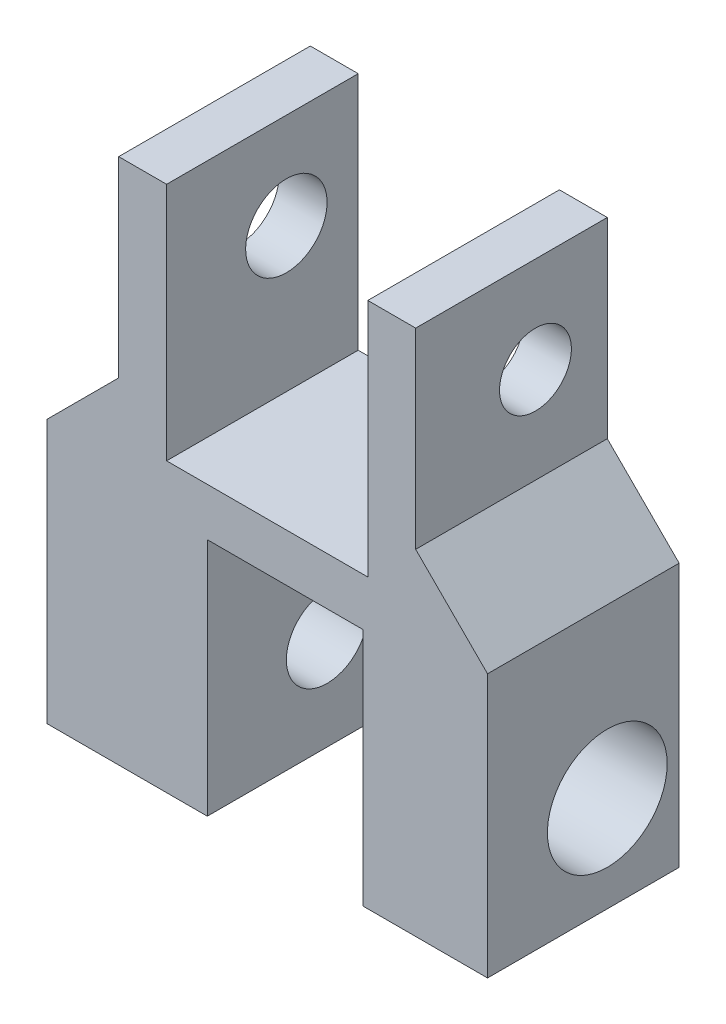
ISO-10303-21;
HEADER;
FILE_DESCRIPTION(('STEP AP214'),'2;1');
FILE_NAME('part.step','',(''),(''),'','','');
FILE_SCHEMA(('AUTOMOTIVE_DESIGN { 1 0 10303 214 1 1 1 1 }'));
ENDSEC;
DATA;
#1=APPLICATION_CONTEXT('core data for automotive mechanical design processes');
#2=APPLICATION_PROTOCOL_DEFINITION('international standard','automotive_design',2000,#1);
#3=PRODUCT_CONTEXT('',#1,'mechanical');
#4=PRODUCT('Part','Part','',(#3));
#5=PRODUCT_RELATED_PRODUCT_CATEGORY('part','',(#4));
#6=PRODUCT_DEFINITION_FORMATION('','',#4);
#7=PRODUCT_DEFINITION_CONTEXT('part definition',#1,'design');
#8=PRODUCT_DEFINITION('design','',#6,#7);
#9=PRODUCT_DEFINITION_SHAPE('','',#8);
#10=(LENGTH_UNIT() NAMED_UNIT(*) SI_UNIT(.MILLI.,.METRE.));
#11=(NAMED_UNIT(*) PLANE_ANGLE_UNIT() SI_UNIT($,.RADIAN.));
#12=(NAMED_UNIT(*) SI_UNIT($,.STERADIAN.) SOLID_ANGLE_UNIT());
#13=UNCERTAINTY_MEASURE_WITH_UNIT(LENGTH_MEASURE(1.E-05),#10,'distance_accuracy_value','');
#14=(GEOMETRIC_REPRESENTATION_CONTEXT(3) GLOBAL_UNCERTAINTY_ASSIGNED_CONTEXT((#13)) GLOBAL_UNIT_ASSIGNED_CONTEXT((#10,
#11,#12)) REPRESENTATION_CONTEXT('',''));
#15=CARTESIAN_POINT('',(0.,0.,0.));
#16=DIRECTION('',(0.,0.,1.));
#17=DIRECTION('',(1.,0.,0.));
#18=AXIS2_PLACEMENT_3D('',#15,#16,#17);
#19=CARTESIAN_POINT('',(4.2,0.,8.));
#20=DIRECTION('',(1.,0.,0.));
#21=DIRECTION('',(0.,0.,-1.));
#22=AXIS2_PLACEMENT_3D('',#19,#20,#21);
#23=PLANE('',#22);
#24=CARTESIAN_POINT('',(4.2,6.,3.));
#25=DIRECTION('',(-1.,0.,0.));
#26=DIRECTION('',(0.,-1.,0.));
#27=AXIS2_PLACEMENT_3D('',#24,#25,#26);
#28=CIRCLE('',#27,1.5);
#29=CARTESIAN_POINT('',(4.2,4.5,3.));
#30=VERTEX_POINT('',#29);
#31=EDGE_CURVE('E318',#30,#30,#28,.T.);
#32=ORIENTED_EDGE('',*,*,#31,.F.);
#33=EDGE_LOOP('',(#32));
#34=FACE_BOUND('',#33,.T.);
#35=DIRECTION('',(0.,-1.,0.));
#36=VECTOR('',#35,1.);
#37=CARTESIAN_POINT('',(4.2,0.,0.));
#38=LINE('',#37,#36);
#39=CARTESIAN_POINT('',(4.2,10.,0.));
#40=VERTEX_POINT('',#39);
#41=CARTESIAN_POINT('',(4.2,0.,0.));
#42=VERTEX_POINT('',#41);
#43=EDGE_CURVE('E179',#40,#42,#38,.T.);
#44=ORIENTED_EDGE('',*,*,#43,.T.);
#45=DIRECTION('',(0.,0.,-1.));
#46=VECTOR('',#45,1.);
#47=CARTESIAN_POINT('',(4.2,0.,8.));
#48=LINE('',#47,#46);
#49=CARTESIAN_POINT('',(4.2,0.,8.));
#50=VERTEX_POINT('',#49);
#51=EDGE_CURVE('E11',#50,#42,#48,.T.);
#52=ORIENTED_EDGE('',*,*,#51,.F.);
#53=DIRECTION('',(0.,-1.,0.));
#54=VECTOR('',#53,1.);
#55=CARTESIAN_POINT('',(4.2,0.,8.));
#56=LINE('',#55,#54);
#57=CARTESIAN_POINT('',(4.2,10.,8.));
#58=VERTEX_POINT('',#57);
#59=EDGE_CURVE('E211',#58,#50,#56,.T.);
#60=ORIENTED_EDGE('',*,*,#59,.F.);
#61=DIRECTION('',(0.,0.,-1.));
#62=VECTOR('',#61,1.);
#63=CARTESIAN_POINT('',(4.2,10.,8.));
#64=LINE('',#63,#62);
#65=EDGE_CURVE('E175',#58,#40,#64,.T.);
#66=ORIENTED_EDGE('',*,*,#65,.T.);
#67=EDGE_LOOP('',(#44,#52,#60,#66));
#68=FACE_BOUND('',#67,.T.);
#69=ADVANCED_FACE('F34',(#34,#68),#23,.F.);
#70=CARTESIAN_POINT('',(-4.2,0.,8.));
#71=DIRECTION('',(0.,-1.,0.));
#72=DIRECTION('',(1.,0.,0.));
#73=AXIS2_PLACEMENT_3D('',#70,#71,#72);
#74=PLANE('',#73);
#75=DIRECTION('',(-1.,0.,0.));
#76=VECTOR('',#75,1.);
#77=CARTESIAN_POINT('',(-4.2,0.,0.));
#78=LINE('',#77,#76);
#79=CARTESIAN_POINT('',(-4.2,0.,0.));
#80=VERTEX_POINT('',#79);
#81=EDGE_CURVE('E182',#42,#80,#78,.T.);
#82=ORIENTED_EDGE('',*,*,#81,.T.);
#83=DIRECTION('',(0.,0.,-1.));
#84=VECTOR('',#83,1.);
#85=CARTESIAN_POINT('',(-4.2,0.,8.));
#86=LINE('',#85,#84);
#87=CARTESIAN_POINT('',(-4.2,0.,8.));
#88=VERTEX_POINT('',#87);
#89=EDGE_CURVE('E43',#88,#80,#86,.T.);
#90=ORIENTED_EDGE('',*,*,#89,.F.);
#91=DIRECTION('',(-1.,0.,0.));
#92=VECTOR('',#91,1.);
#93=CARTESIAN_POINT('',(-4.2,0.,8.));
#94=LINE('',#93,#92);
#95=EDGE_CURVE('E118',#50,#88,#94,.T.);
#96=ORIENTED_EDGE('',*,*,#95,.F.);
#97=ORIENTED_EDGE('',*,*,#51,.T.);
#98=EDGE_LOOP('',(#82,#90,#96,#97));
#99=FACE_BOUND('',#98,.T.);
#100=ADVANCED_FACE('F311',(#99),#74,.F.);
#101=CARTESIAN_POINT('',(-4.2,0.,8.));
#102=DIRECTION('',(-1.,0.,0.));
#103=DIRECTION('',(0.,-1.,0.));
#104=AXIS2_PLACEMENT_3D('',#101,#102,#103);
#105=PLANE('',#104);
#106=CARTESIAN_POINT('',(-4.2,6.,3.));
#107=DIRECTION('',(-1.,0.,0.));
#108=DIRECTION('',(0.,-1.,0.));
#109=AXIS2_PLACEMENT_3D('',#106,#107,#108);
#110=CIRCLE('',#109,1.7);
#111=CARTESIAN_POINT('',(-4.2,4.3,3.));
#112=VERTEX_POINT('',#111);
#113=EDGE_CURVE('E324',#112,#112,#110,.F.);
#114=ORIENTED_EDGE('',*,*,#113,.F.);
#115=EDGE_LOOP('',(#114));
#116=FACE_BOUND('',#115,.T.);
#117=DIRECTION('',(0.,1.,0.));
#118=VECTOR('',#117,1.);
#119=CARTESIAN_POINT('',(-4.2,0.,0.));
#120=LINE('',#119,#118);
#121=CARTESIAN_POINT('',(-4.2,10.,0.));
#122=VERTEX_POINT('',#121);
#123=EDGE_CURVE('E185',#80,#122,#120,.T.);
#124=ORIENTED_EDGE('',*,*,#123,.T.);
#125=DIRECTION('',(0.,0.,-1.));
#126=VECTOR('',#125,1.);
#127=CARTESIAN_POINT('',(-4.2,10.,8.));
#128=LINE('',#127,#126);
#129=CARTESIAN_POINT('',(-4.2,10.,8.));
#130=VERTEX_POINT('',#129);
#131=EDGE_CURVE('E242',#130,#122,#128,.T.);
#132=ORIENTED_EDGE('',*,*,#131,.F.);
#133=DIRECTION('',(0.,1.,0.));
#134=VECTOR('',#133,1.);
#135=CARTESIAN_POINT('',(-4.2,0.,8.));
#136=LINE('',#135,#134);
#137=EDGE_CURVE('E251',#88,#130,#136,.T.);
#138=ORIENTED_EDGE('',*,*,#137,.F.);
#139=ORIENTED_EDGE('',*,*,#89,.T.);
#140=EDGE_LOOP('',(#124,#132,#138,#139));
#141=FACE_BOUND('',#140,.T.);
#142=ADVANCED_FACE('F249',(#116,#141),#105,.F.);
#143=CARTESIAN_POINT('',(-4.2,10.,8.));
#144=DIRECTION('',(0.,-1.,0.));
#145=DIRECTION('',(0.,0.,-1.));
#146=AXIS2_PLACEMENT_3D('',#143,#144,#145);
#147=PLANE('',#146);
#148=DIRECTION('',(-1.,0.,0.));
#149=VECTOR('',#148,1.);
#150=CARTESIAN_POINT('',(-4.2,10.,0.));
#151=LINE('',#150,#149);
#152=CARTESIAN_POINT('',(-6.2,10.,0.));
#153=VERTEX_POINT('',#152);
#154=EDGE_CURVE('E187',#122,#153,#151,.T.);
#155=ORIENTED_EDGE('',*,*,#154,.T.);
#156=DIRECTION('',(0.,0.,-1.));
#157=VECTOR('',#156,1.);
#158=CARTESIAN_POINT('',(-6.2,10.,8.));
#159=LINE('',#158,#157);
#160=CARTESIAN_POINT('',(-6.2,10.,8.));
#161=VERTEX_POINT('',#160);
#162=EDGE_CURVE('E239',#161,#153,#159,.T.);
#163=ORIENTED_EDGE('',*,*,#162,.F.);
#164=DIRECTION('',(-1.,0.,0.));
#165=VECTOR('',#164,1.);
#166=CARTESIAN_POINT('',(-4.2,10.,8.));
#167=LINE('',#166,#165);
#168=EDGE_CURVE('E269',#130,#161,#167,.T.);
#169=ORIENTED_EDGE('',*,*,#168,.F.);
#170=ORIENTED_EDGE('',*,*,#131,.T.);
#171=EDGE_LOOP('',(#155,#163,#169,#170));
#172=FACE_BOUND('',#171,.T.);
#173=ADVANCED_FACE('F260',(#172),#147,.F.);
#174=CARTESIAN_POINT('',(-6.2,10.,8.));
#175=DIRECTION('',(1.,0.,0.));
#176=DIRECTION('',(0.,1.,0.));
#177=AXIS2_PLACEMENT_3D('',#174,#175,#176);
#178=PLANE('',#177);
#179=CARTESIAN_POINT('',(-6.2,6.,3.));
#180=DIRECTION('',(-1.,0.,0.));
#181=DIRECTION('',(0.,-1.,0.));
#182=AXIS2_PLACEMENT_3D('',#179,#180,#181);
#183=CIRCLE('',#182,1.7);
#184=CARTESIAN_POINT('',(-6.2,4.3,3.));
#185=VERTEX_POINT('',#184);
#186=EDGE_CURVE('E322',#185,#185,#183,.T.);
#187=ORIENTED_EDGE('',*,*,#186,.F.);
#188=EDGE_LOOP('',(#187));
#189=FACE_BOUND('',#188,.T.);
#190=DIRECTION('',(0.,-1.,0.));
#191=VECTOR('',#190,1.);
#192=CARTESIAN_POINT('',(-6.2,10.,0.));
#193=LINE('',#192,#191);
#194=CARTESIAN_POINT('',(-6.2,2.00000000000003,0.));
#195=VERTEX_POINT('',#194);
#196=EDGE_CURVE('E189',#153,#195,#193,.T.);
#197=ORIENTED_EDGE('',*,*,#196,.T.);
#198=DIRECTION('',(0.,0.,-1.));
#199=VECTOR('',#198,1.);
#200=CARTESIAN_POINT('',(-6.2,2.00000000000003,8.));
#201=LINE('',#200,#199);
#202=CARTESIAN_POINT('',(-6.2,2.00000000000003,8.));
#203=VERTEX_POINT('',#202);
#204=EDGE_CURVE('E236',#203,#195,#201,.T.);
#205=ORIENTED_EDGE('',*,*,#204,.F.);
#206=DIRECTION('',(0.,-1.,0.));
#207=VECTOR('',#206,1.);
#208=CARTESIAN_POINT('',(-6.2,10.,8.));
#209=LINE('',#208,#207);
#210=EDGE_CURVE('E266',#161,#203,#209,.T.);
#211=ORIENTED_EDGE('',*,*,#210,.F.);
#212=ORIENTED_EDGE('',*,*,#162,.T.);
#213=EDGE_LOOP('',(#197,#205,#211,#212));
#214=FACE_BOUND('',#213,.T.);
#215=ADVANCED_FACE('F264',(#189,#214),#178,.F.);
#216=CARTESIAN_POINT('',(-9.2,-0.999999999999999,8.));
#217=DIRECTION('',(0.707106781186552,-0.707106781186543,0.));
#218=DIRECTION('',(0.707106781186543,0.707106781186552,0.));
#219=AXIS2_PLACEMENT_3D('',#216,#217,#218);
#220=PLANE('',#219);
#221=DIRECTION('',(-0.707106781186543,-0.707106781186551,0.));
#222=VECTOR('',#221,1.);
#223=CARTESIAN_POINT('',(-9.2,-0.999999999999999,0.));
#224=LINE('',#223,#222);
#225=CARTESIAN_POINT('',(-9.2,-0.999999999999999,0.));
#226=VERTEX_POINT('',#225);
#227=EDGE_CURVE('E191',#195,#226,#224,.T.);
#228=ORIENTED_EDGE('',*,*,#227,.T.);
#229=DIRECTION('',(0.,0.,-1.));
#230=VECTOR('',#229,1.);
#231=CARTESIAN_POINT('',(-9.2,-0.999999999999999,8.));
#232=LINE('',#231,#230);
#233=CARTESIAN_POINT('',(-9.2,-0.999999999999999,8.));
#234=VERTEX_POINT('',#233);
#235=EDGE_CURVE('E233',#234,#226,#232,.T.);
#236=ORIENTED_EDGE('',*,*,#235,.F.);
#237=DIRECTION('',(-0.707106781186543,-0.707106781186551,0.));
#238=VECTOR('',#237,1.);
#239=CARTESIAN_POINT('',(-9.2,-0.999999999999999,8.));
#240=LINE('',#239,#238);
#241=EDGE_CURVE('E268',#203,#234,#240,.T.);
#242=ORIENTED_EDGE('',*,*,#241,.F.);
#243=ORIENTED_EDGE('',*,*,#204,.T.);
#244=EDGE_LOOP('',(#228,#236,#242,#243));
#245=FACE_BOUND('',#244,.T.);
#246=ADVANCED_FACE('F371',(#245),#220,.F.);
#247=CARTESIAN_POINT('',(-9.2,-0.999999999999999,8.));
#248=DIRECTION('',(1.,0.,0.));
#249=DIRECTION('',(0.,1.,0.));
#250=AXIS2_PLACEMENT_3D('',#247,#248,#249);
#251=PLANE('',#250);
#252=CARTESIAN_POINT('',(-9.2,-7.99999999999999,3.));
#253=DIRECTION('',(-1.,0.,0.));
#254=DIRECTION('',(0.,0.,1.));
#255=AXIS2_PLACEMENT_3D('',#252,#253,#254);
#256=CIRCLE('',#255,1.7);
#257=CARTESIAN_POINT('',(-9.2,-7.99999999999999,4.7));
#258=VERTEX_POINT('',#257);
#259=EDGE_CURVE('E327',#258,#258,#256,.T.);
#260=ORIENTED_EDGE('',*,*,#259,.F.);
#261=EDGE_LOOP('',(#260));
#262=FACE_BOUND('',#261,.T.);
#263=DIRECTION('',(0.,-1.,0.));
#264=VECTOR('',#263,1.);
#265=CARTESIAN_POINT('',(-9.2,-0.999999999999999,0.));
#266=LINE('',#265,#264);
#267=CARTESIAN_POINT('',(-9.2,-12.,0.));
#268=VERTEX_POINT('',#267);
#269=EDGE_CURVE('E193',#226,#268,#266,.T.);
#270=ORIENTED_EDGE('',*,*,#269,.T.);
#271=DIRECTION('',(0.,0.,-1.));
#272=VECTOR('',#271,1.);
#273=CARTESIAN_POINT('',(-9.2,-12.,8.));
#274=LINE('',#273,#272);
#275=CARTESIAN_POINT('',(-9.2,-12.,8.));
#276=VERTEX_POINT('',#275);
#277=EDGE_CURVE('E230',#276,#268,#274,.T.);
#278=ORIENTED_EDGE('',*,*,#277,.F.);
#279=DIRECTION('',(0.,-1.,0.));
#280=VECTOR('',#279,1.);
#281=CARTESIAN_POINT('',(-9.2,-0.999999999999999,8.));
#282=LINE('',#281,#280);
#283=EDGE_CURVE('E271',#234,#276,#282,.T.);
#284=ORIENTED_EDGE('',*,*,#283,.F.);
#285=ORIENTED_EDGE('',*,*,#235,.T.);
#286=EDGE_LOOP('',(#270,#278,#284,#285));
#287=FACE_BOUND('',#286,.T.);
#288=ADVANCED_FACE('F368',(#262,#287),#251,.F.);
#289=CARTESIAN_POINT('',(-9.2,-12.,8.));
#290=DIRECTION('',(0.,1.,0.));
#291=DIRECTION('',(-1.,0.,0.));
#292=AXIS2_PLACEMENT_3D('',#289,#290,#291);
#293=PLANE('',#292);
#294=DIRECTION('',(1.,0.,0.));
#295=VECTOR('',#294,1.);
#296=CARTESIAN_POINT('',(-9.2,-12.,0.));
#297=LINE('',#296,#295);
#298=CARTESIAN_POINT('',(-2.5,-12.,0.));
#299=VERTEX_POINT('',#298);
#300=EDGE_CURVE('E195',#268,#299,#297,.T.);
#301=ORIENTED_EDGE('',*,*,#300,.T.);
#302=DIRECTION('',(0.,0.,-1.));
#303=VECTOR('',#302,1.);
#304=CARTESIAN_POINT('',(-2.5,-12.,8.));
#305=LINE('',#304,#303);
#306=CARTESIAN_POINT('',(-2.5,-12.,8.));
#307=VERTEX_POINT('',#306);
#308=EDGE_CURVE('E227',#307,#299,#305,.T.);
#309=ORIENTED_EDGE('',*,*,#308,.F.);
#310=DIRECTION('',(1.,0.,0.));
#311=VECTOR('',#310,1.);
#312=CARTESIAN_POINT('',(-9.2,-12.,8.));
#313=LINE('',#312,#311);
#314=EDGE_CURVE('E277',#276,#307,#313,.T.);
#315=ORIENTED_EDGE('',*,*,#314,.F.);
#316=ORIENTED_EDGE('',*,*,#277,.T.);
#317=EDGE_LOOP('',(#301,#309,#315,#316));
#318=FACE_BOUND('',#317,.T.);
#319=ADVANCED_FACE('F365',(#318),#293,.F.);
#320=CARTESIAN_POINT('',(-2.5,-12.,8.));
#321=DIRECTION('',(-1.,0.,0.));
#322=DIRECTION('',(0.,0.,1.));
#323=AXIS2_PLACEMENT_3D('',#320,#321,#322);
#324=PLANE('',#323);
#325=CARTESIAN_POINT('',(-2.5,-7.99999999999999,3.));
#326=DIRECTION('',(-1.,0.,0.));
#327=DIRECTION('',(0.,0.,1.));
#328=AXIS2_PLACEMENT_3D('',#325,#326,#327);
#329=CIRCLE('',#328,1.7);
#330=CARTESIAN_POINT('',(-2.5,-7.99999999999999,4.7));
#331=VERTEX_POINT('',#330);
#332=EDGE_CURVE('E332',#331,#331,#329,.F.);
#333=ORIENTED_EDGE('',*,*,#332,.F.);
#334=EDGE_LOOP('',(#333));
#335=FACE_BOUND('',#334,.T.);
#336=DIRECTION('',(0.,1.,0.));
#337=VECTOR('',#336,1.);
#338=CARTESIAN_POINT('',(-2.5,-12.,0.));
#339=LINE('',#338,#337);
#340=CARTESIAN_POINT('',(-2.5,-2.,0.));
#341=VERTEX_POINT('',#340);
#342=EDGE_CURVE('E197',#299,#341,#339,.T.);
#343=ORIENTED_EDGE('',*,*,#342,.T.);
#344=DIRECTION('',(0.,0.,-1.));
#345=VECTOR('',#344,1.);
#346=CARTESIAN_POINT('',(-2.5,-2.,8.));
#347=LINE('',#346,#345);
#348=CARTESIAN_POINT('',(-2.5,-2.,8.));
#349=VERTEX_POINT('',#348);
#350=EDGE_CURVE('E224',#349,#341,#347,.T.);
#351=ORIENTED_EDGE('',*,*,#350,.F.);
#352=DIRECTION('',(0.,1.,0.));
#353=VECTOR('',#352,1.);
#354=CARTESIAN_POINT('',(-2.5,-12.,8.));
#355=LINE('',#354,#353);
#356=EDGE_CURVE('E279',#307,#349,#355,.T.);
#357=ORIENTED_EDGE('',*,*,#356,.F.);
#358=ORIENTED_EDGE('',*,*,#308,.T.);
#359=EDGE_LOOP('',(#343,#351,#357,#358));
#360=FACE_BOUND('',#359,.T.);
#361=ADVANCED_FACE('F357',(#335,#360),#324,.F.);
#362=CARTESIAN_POINT('',(4.,-2.,8.));
#363=DIRECTION('',(0.,1.,0.));
#364=DIRECTION('',(-1.,0.,0.));
#365=AXIS2_PLACEMENT_3D('',#362,#363,#364);
#366=PLANE('',#365);
#367=DIRECTION('',(1.,0.,0.));
#368=VECTOR('',#367,1.);
#369=CARTESIAN_POINT('',(4.,-2.,0.));
#370=LINE('',#369,#368);
#371=CARTESIAN_POINT('',(4.,-2.,0.));
#372=VERTEX_POINT('',#371);
#373=EDGE_CURVE('E200',#341,#372,#370,.T.);
#374=ORIENTED_EDGE('',*,*,#373,.T.);
#375=DIRECTION('',(0.,0.,-1.));
#376=VECTOR('',#375,1.);
#377=CARTESIAN_POINT('',(4.,-2.,8.));
#378=LINE('',#377,#376);
#379=CARTESIAN_POINT('',(4.,-2.,8.));
#380=VERTEX_POINT('',#379);
#381=EDGE_CURVE('E221',#380,#372,#378,.T.);
#382=ORIENTED_EDGE('',*,*,#381,.F.);
#383=DIRECTION('',(1.,0.,0.));
#384=VECTOR('',#383,1.);
#385=CARTESIAN_POINT('',(-2.5,-2.,8.));
#386=LINE('',#385,#384);
#387=EDGE_CURVE('E281',#349,#380,#386,.T.);
#388=ORIENTED_EDGE('',*,*,#387,.F.);
#389=ORIENTED_EDGE('',*,*,#350,.T.);
#390=EDGE_LOOP('',(#374,#382,#388,#389));
#391=FACE_BOUND('',#390,.T.);
#392=ADVANCED_FACE('F348',(#391),#366,.F.);
#393=CARTESIAN_POINT('',(4.,-12.,8.));
#394=DIRECTION('',(1.,0.,0.));
#395=DIRECTION('',(0.,0.,-1.));
#396=AXIS2_PLACEMENT_3D('',#393,#394,#395);
#397=PLANE('',#396);
#398=CARTESIAN_POINT('',(4.,-7.99999999999999,3.));
#399=DIRECTION('',(1.,0.,0.));
#400=DIRECTION('',(0.,0.,-1.));
#401=AXIS2_PLACEMENT_3D('',#398,#399,#400);
#402=CIRCLE('',#401,2.5);
#403=CARTESIAN_POINT('',(4.,-7.99999999999999,0.499999999999999));
#404=VERTEX_POINT('',#403);
#405=EDGE_CURVE('E183',#404,#404,#402,.F.);
#406=ORIENTED_EDGE('',*,*,#405,.F.);
#407=EDGE_LOOP('',(#406));
#408=FACE_BOUND('',#407,.T.);
#409=DIRECTION('',(0.,-1.,0.));
#410=VECTOR('',#409,1.);
#411=CARTESIAN_POINT('',(4.,-12.,0.));
#412=LINE('',#411,#410);
#413=CARTESIAN_POINT('',(4.,-12.,0.));
#414=VERTEX_POINT('',#413);
#415=EDGE_CURVE('E202',#372,#414,#412,.T.);
#416=ORIENTED_EDGE('',*,*,#415,.T.);
#417=DIRECTION('',(0.,0.,-1.));
#418=VECTOR('',#417,1.);
#419=CARTESIAN_POINT('',(4.,-12.,8.));
#420=LINE('',#419,#418);
#421=CARTESIAN_POINT('',(4.,-12.,8.));
#422=VERTEX_POINT('',#421);
#423=EDGE_CURVE('E218',#422,#414,#420,.T.);
#424=ORIENTED_EDGE('',*,*,#423,.F.);
#425=DIRECTION('',(0.,-1.,0.));
#426=VECTOR('',#425,1.);
#427=CARTESIAN_POINT('',(4.,-12.,8.));
#428=LINE('',#427,#426);
#429=EDGE_CURVE('E283',#380,#422,#428,.T.);
#430=ORIENTED_EDGE('',*,*,#429,.F.);
#431=ORIENTED_EDGE('',*,*,#381,.T.);
#432=EDGE_LOOP('',(#416,#424,#430,#431));
#433=FACE_BOUND('',#432,.T.);
#434=ADVANCED_FACE('F345',(#408,#433),#397,.F.);
#435=CARTESIAN_POINT('',(4.,-12.,8.));
#436=DIRECTION('',(0.,1.,0.));
#437=DIRECTION('',(-1.,0.,0.));
#438=AXIS2_PLACEMENT_3D('',#435,#436,#437);
#439=PLANE('',#438);
#440=DIRECTION('',(1.,0.,0.));
#441=VECTOR('',#440,1.);
#442=CARTESIAN_POINT('',(4.,-12.,0.));
#443=LINE('',#442,#441);
#444=CARTESIAN_POINT('',(9.2,-12.,0.));
#445=VERTEX_POINT('',#444);
#446=EDGE_CURVE('E204',#414,#445,#443,.T.);
#447=ORIENTED_EDGE('',*,*,#446,.T.);
#448=DIRECTION('',(0.,0.,-1.));
#449=VECTOR('',#448,1.);
#450=CARTESIAN_POINT('',(9.2,-12.,8.));
#451=LINE('',#450,#449);
#452=CARTESIAN_POINT('',(9.2,-12.,8.));
#453=VERTEX_POINT('',#452);
#454=EDGE_CURVE('E215',#453,#445,#451,.T.);
#455=ORIENTED_EDGE('',*,*,#454,.F.);
#456=DIRECTION('',(1.,0.,0.));
#457=VECTOR('',#456,1.);
#458=CARTESIAN_POINT('',(4.,-12.,8.));
#459=LINE('',#458,#457);
#460=EDGE_CURVE('E285',#422,#453,#459,.T.);
#461=ORIENTED_EDGE('',*,*,#460,.F.);
#462=ORIENTED_EDGE('',*,*,#423,.T.);
#463=EDGE_LOOP('',(#447,#455,#461,#462));
#464=FACE_BOUND('',#463,.T.);
#465=ADVANCED_FACE('F291',(#464),#439,.F.);
#466=CARTESIAN_POINT('',(9.2,-0.999999999999997,8.));
#467=DIRECTION('',(-1.,0.,0.));
#468=DIRECTION('',(0.,-1.,0.));
#469=AXIS2_PLACEMENT_3D('',#466,#467,#468);
#470=PLANE('',#469);
#471=CARTESIAN_POINT('',(9.2,-7.99999999999999,3.));
#472=DIRECTION('',(-1.,0.,0.));
#473=DIRECTION('',(0.,-1.,0.));
#474=AXIS2_PLACEMENT_3D('',#471,#472,#473);
#475=CIRCLE('',#474,2.5);
#476=CARTESIAN_POINT('',(9.2,-10.5,3.));
#477=VERTEX_POINT('',#476);
#478=EDGE_CURVE('E335',#477,#477,#475,.T.);
#479=ORIENTED_EDGE('',*,*,#478,.T.);
#480=EDGE_LOOP('',(#479));
#481=FACE_BOUND('',#480,.T.);
#482=DIRECTION('',(0.,1.,0.));
#483=VECTOR('',#482,1.);
#484=CARTESIAN_POINT('',(9.2,-0.999999999999997,0.));
#485=LINE('',#484,#483);
#486=CARTESIAN_POINT('',(9.2,-0.999999999999997,0.));
#487=VERTEX_POINT('',#486);
#488=EDGE_CURVE('E206',#445,#487,#485,.T.);
#489=ORIENTED_EDGE('',*,*,#488,.T.);
#490=DIRECTION('',(0.,0.,-1.));
#491=VECTOR('',#490,1.);
#492=CARTESIAN_POINT('',(9.2,-0.999999999999997,8.));
#493=LINE('',#492,#491);
#494=CARTESIAN_POINT('',(9.2,-0.999999999999997,8.));
#495=VERTEX_POINT('',#494);
#496=EDGE_CURVE('E170',#495,#487,#493,.T.);
#497=ORIENTED_EDGE('',*,*,#496,.F.);
#498=DIRECTION('',(0.,1.,0.));
#499=VECTOR('',#498,1.);
#500=CARTESIAN_POINT('',(9.2,-0.999999999999997,8.));
#501=LINE('',#500,#499);
#502=EDGE_CURVE('E161',#453,#495,#501,.T.);
#503=ORIENTED_EDGE('',*,*,#502,.F.);
#504=ORIENTED_EDGE('',*,*,#454,.T.);
#505=EDGE_LOOP('',(#489,#497,#503,#504));
#506=FACE_BOUND('',#505,.T.);
#507=ADVANCED_FACE('F295',(#481,#506),#470,.F.);
#508=CARTESIAN_POINT('',(9.2,-0.999999999999997,8.));
#509=DIRECTION('',(-0.707106781186552,-0.707106781186543,0.));
#510=DIRECTION('',(0.707106781186543,-0.707106781186552,0.));
#511=AXIS2_PLACEMENT_3D('',#508,#509,#510);
#512=PLANE('',#511);
#513=DIRECTION('',(-0.707106781186543,0.707106781186552,0.));
#514=VECTOR('',#513,1.);
#515=CARTESIAN_POINT('',(9.2,-0.999999999999997,0.));
#516=LINE('',#515,#514);
#517=CARTESIAN_POINT('',(6.2,2.00000000000004,0.));
#518=VERTEX_POINT('',#517);
#519=EDGE_CURVE('E169',#487,#518,#516,.T.);
#520=ORIENTED_EDGE('',*,*,#519,.T.);
#521=DIRECTION('',(0.,0.,-1.));
#522=VECTOR('',#521,1.);
#523=CARTESIAN_POINT('',(6.2,2.00000000000004,8.));
#524=LINE('',#523,#522);
#525=CARTESIAN_POINT('',(6.2,2.00000000000004,8.));
#526=VERTEX_POINT('',#525);
#527=EDGE_CURVE('E166',#526,#518,#524,.T.);
#528=ORIENTED_EDGE('',*,*,#527,.F.);
#529=DIRECTION('',(-0.707106781186543,0.707106781186552,0.));
#530=VECTOR('',#529,1.);
#531=CARTESIAN_POINT('',(9.2,-0.999999999999997,8.));
#532=LINE('',#531,#530);
#533=EDGE_CURVE('E155',#495,#526,#532,.T.);
#534=ORIENTED_EDGE('',*,*,#533,.F.);
#535=ORIENTED_EDGE('',*,*,#496,.T.);
#536=EDGE_LOOP('',(#520,#528,#534,#535));
#537=FACE_BOUND('',#536,.T.);
#538=ADVANCED_FACE('F167',(#537),#512,.F.);
#539=CARTESIAN_POINT('',(6.2,10.,8.));
#540=DIRECTION('',(-1.,0.,0.));
#541=DIRECTION('',(0.,0.,1.));
#542=AXIS2_PLACEMENT_3D('',#539,#540,#541);
#543=PLANE('',#542);
#544=CARTESIAN_POINT('',(6.2,6.,3.));
#545=DIRECTION('',(-1.,0.,0.));
#546=DIRECTION('',(0.,0.,1.));
#547=AXIS2_PLACEMENT_3D('',#544,#545,#546);
#548=CIRCLE('',#547,1.5);
#549=CARTESIAN_POINT('',(6.2,6.,4.5));
#550=VERTEX_POINT('',#549);
#551=EDGE_CURVE('E37',#550,#550,#548,.T.);
#552=ORIENTED_EDGE('',*,*,#551,.T.);
#553=EDGE_LOOP('',(#552));
#554=FACE_BOUND('',#553,.T.);
#555=DIRECTION('',(0.,1.,0.));
#556=VECTOR('',#555,1.);
#557=CARTESIAN_POINT('',(6.2,10.,0.));
#558=LINE('',#557,#556);
#559=CARTESIAN_POINT('',(6.2,10.,0.));
#560=VERTEX_POINT('',#559);
#561=EDGE_CURVE('E104',#518,#560,#558,.T.);
#562=ORIENTED_EDGE('',*,*,#561,.T.);
#563=DIRECTION('',(0.,0.,-1.));
#564=VECTOR('',#563,1.);
#565=CARTESIAN_POINT('',(6.2,10.,8.));
#566=LINE('',#565,#564);
#567=CARTESIAN_POINT('',(6.2,10.,8.));
#568=VERTEX_POINT('',#567);
#569=EDGE_CURVE('E171',#568,#560,#566,.T.);
#570=ORIENTED_EDGE('',*,*,#569,.F.);
#571=DIRECTION('',(0.,1.,0.));
#572=VECTOR('',#571,1.);
#573=CARTESIAN_POINT('',(6.2,10.,8.));
#574=LINE('',#573,#572);
#575=EDGE_CURVE('E159',#526,#568,#574,.T.);
#576=ORIENTED_EDGE('',*,*,#575,.F.);
#577=ORIENTED_EDGE('',*,*,#527,.T.);
#578=EDGE_LOOP('',(#562,#570,#576,#577));
#579=FACE_BOUND('',#578,.T.);
#580=ADVANCED_FACE('F173',(#554,#579),#543,.F.);
#581=CARTESIAN_POINT('',(4.2,10.,8.));
#582=DIRECTION('',(0.,-1.,0.));
#583=DIRECTION('',(0.,0.,-1.));
#584=AXIS2_PLACEMENT_3D('',#581,#582,#583);
#585=PLANE('',#584);
#586=DIRECTION('',(-1.,0.,0.));
#587=VECTOR('',#586,1.);
#588=CARTESIAN_POINT('',(4.2,10.,0.));
#589=LINE('',#588,#587);
#590=EDGE_CURVE('E110',#560,#40,#589,.T.);
#591=ORIENTED_EDGE('',*,*,#590,.T.);
#592=ORIENTED_EDGE('',*,*,#65,.F.);
#593=DIRECTION('',(-1.,0.,0.));
#594=VECTOR('',#593,1.);
#595=CARTESIAN_POINT('',(4.2,10.,8.));
#596=LINE('',#595,#594);
#597=EDGE_CURVE('E51',#568,#58,#596,.T.);
#598=ORIENTED_EDGE('',*,*,#597,.F.);
#599=ORIENTED_EDGE('',*,*,#569,.T.);
#600=EDGE_LOOP('',(#591,#592,#598,#599));
#601=FACE_BOUND('',#600,.T.);
#602=ADVANCED_FACE('F299',(#601),#585,.F.);
#603=CARTESIAN_POINT('',(0.,0.,8.));
#604=DIRECTION('',(0.,0.,-1.));
#605=DIRECTION('',(-1.,0.,0.));
#606=AXIS2_PLACEMENT_3D('',#603,#604,#605);
#607=PLANE('',#606);
#608=ORIENTED_EDGE('',*,*,#59,.T.);
#609=ORIENTED_EDGE('',*,*,#95,.T.);
#610=ORIENTED_EDGE('',*,*,#137,.T.);
#611=ORIENTED_EDGE('',*,*,#168,.T.);
#612=ORIENTED_EDGE('',*,*,#210,.T.);
#613=ORIENTED_EDGE('',*,*,#241,.T.);
#614=ORIENTED_EDGE('',*,*,#283,.T.);
#615=ORIENTED_EDGE('',*,*,#314,.T.);
#616=ORIENTED_EDGE('',*,*,#356,.T.);
#617=ORIENTED_EDGE('',*,*,#387,.T.);
#618=ORIENTED_EDGE('',*,*,#429,.T.);
#619=ORIENTED_EDGE('',*,*,#460,.T.);
#620=ORIENTED_EDGE('',*,*,#502,.T.);
#621=ORIENTED_EDGE('',*,*,#533,.T.);
#622=ORIENTED_EDGE('',*,*,#575,.T.);
#623=ORIENTED_EDGE('',*,*,#597,.T.);
#624=EDGE_LOOP('',(#608,#609,#610,#611,#612,#613,#614,#615,#616,#617,#618,#619,#620,#621,#622,#623));
#625=FACE_BOUND('',#624,.T.);
#626=ADVANCED_FACE('F157',(#625),#607,.F.);
#627=CARTESIAN_POINT('',(0.,0.,0.));
#628=DIRECTION('',(0.,0.,-1.));
#629=DIRECTION('',(-1.,0.,0.));
#630=AXIS2_PLACEMENT_3D('',#627,#628,#629);
#631=PLANE('',#630);
#632=ORIENTED_EDGE('',*,*,#43,.F.);
#633=ORIENTED_EDGE('',*,*,#590,.F.);
#634=ORIENTED_EDGE('',*,*,#561,.F.);
#635=ORIENTED_EDGE('',*,*,#519,.F.);
#636=ORIENTED_EDGE('',*,*,#488,.F.);
#637=ORIENTED_EDGE('',*,*,#446,.F.);
#638=ORIENTED_EDGE('',*,*,#415,.F.);
#639=ORIENTED_EDGE('',*,*,#373,.F.);
#640=ORIENTED_EDGE('',*,*,#342,.F.);
#641=ORIENTED_EDGE('',*,*,#300,.F.);
#642=ORIENTED_EDGE('',*,*,#269,.F.);
#643=ORIENTED_EDGE('',*,*,#227,.F.);
#644=ORIENTED_EDGE('',*,*,#196,.F.);
#645=ORIENTED_EDGE('',*,*,#154,.F.);
#646=ORIENTED_EDGE('',*,*,#123,.F.);
#647=ORIENTED_EDGE('',*,*,#81,.F.);
#648=EDGE_LOOP('',(#632,#633,#634,#635,#636,#637,#638,#639,#640,#641,#642,#643,#644,#645,#646,#647));
#649=FACE_BOUND('',#648,.T.);
#650=ADVANCED_FACE('F255',(#649),#631,.T.);
#651=CARTESIAN_POINT('',(-0.799999999999997,-7.99999999999999,3.));
#652=DIRECTION('',(1.,0.,0.));
#653=DIRECTION('',(0.,1.,0.));
#654=AXIS2_PLACEMENT_3D('',#651,#652,#653);
#655=CYLINDRICAL_SURFACE('',#654,2.5);
#656=ORIENTED_EDGE('',*,*,#478,.F.);
#657=EDGE_LOOP('',(#656));
#658=FACE_BOUND('',#657,.T.);
#659=ORIENTED_EDGE('',*,*,#405,.T.);
#660=EDGE_LOOP('',(#659));
#661=FACE_BOUND('',#660,.T.);
#662=ADVANCED_FACE('F343',(#658,#661),#655,.F.);
#663=CARTESIAN_POINT('',(9.201,-7.99999999999999,3.));
#664=DIRECTION('',(-1.,0.,0.));
#665=DIRECTION('',(0.,0.,1.));
#666=AXIS2_PLACEMENT_3D('',#663,#664,#665);
#667=CYLINDRICAL_SURFACE('',#666,1.7);
#668=ORIENTED_EDGE('',*,*,#259,.T.);
#669=EDGE_LOOP('',(#668));
#670=FACE_BOUND('',#669,.T.);
#671=ORIENTED_EDGE('',*,*,#332,.T.);
#672=EDGE_LOOP('',(#671));
#673=FACE_BOUND('',#672,.T.);
#674=ADVANCED_FACE('F395',(#670,#673),#667,.F.);
#675=CARTESIAN_POINT('',(9.201,6.,3.));
#676=DIRECTION('',(-1.,0.,0.));
#677=DIRECTION('',(0.,-1.,0.));
#678=AXIS2_PLACEMENT_3D('',#675,#676,#677);
#679=CYLINDRICAL_SURFACE('',#678,1.7);
#680=ORIENTED_EDGE('',*,*,#186,.T.);
#681=EDGE_LOOP('',(#680));
#682=FACE_BOUND('',#681,.T.);
#683=ORIENTED_EDGE('',*,*,#113,.T.);
#684=EDGE_LOOP('',(#683));
#685=FACE_BOUND('',#684,.T.);
#686=ADVANCED_FACE('F392',(#682,#685),#679,.F.);
#687=CARTESIAN_POINT('',(9.2,6.,3.));
#688=DIRECTION('',(-1.,0.,0.));
#689=DIRECTION('',(0.,-1.,0.));
#690=AXIS2_PLACEMENT_3D('',#687,#688,#689);
#691=CYLINDRICAL_SURFACE('',#690,1.5);
#692=ORIENTED_EDGE('',*,*,#31,.T.);
#693=EDGE_LOOP('',(#692));
#694=FACE_BOUND('',#693,.T.);
#695=ORIENTED_EDGE('',*,*,#551,.F.);
#696=EDGE_LOOP('',(#695));
#697=FACE_BOUND('',#696,.T.);
#698=ADVANCED_FACE('F394',(#694,#697),#691,.F.);
#699=CLOSED_SHELL('',(#69,#100,#142,#173,#215,#246,#288,#319,#361,#392,#434,#465,#507,#538,#580,
#602,#626,#650,#662,#674,#686,#698));
#700=MANIFOLD_SOLID_BREP('B2',#699);
#701=ADVANCED_BREP_SHAPE_REPRESENTATION('',(#18,#700),#14);
#702=SHAPE_DEFINITION_REPRESENTATION(#9,#701);
ENDSEC;
END-ISO-10303-21;
